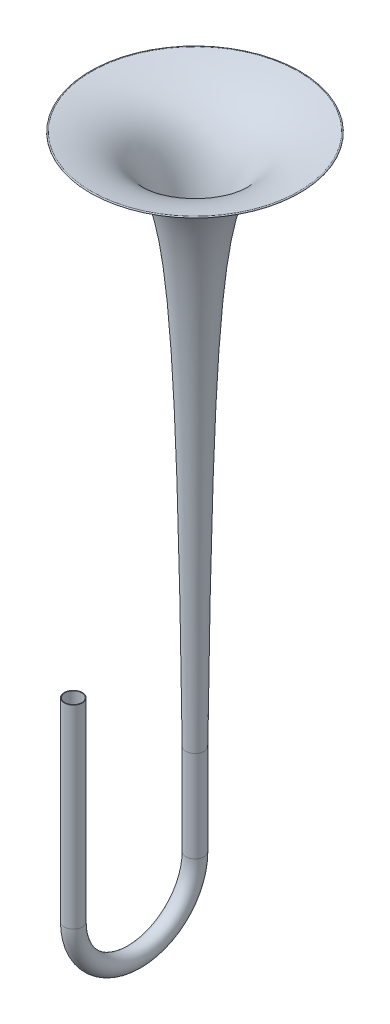
ISO-10303-21;
HEADER;
FILE_DESCRIPTION(('STEP AP214'),'2;1');
FILE_NAME('part.step','',(''),(''),'','','');
FILE_SCHEMA(('AUTOMOTIVE_DESIGN { 1 0 10303 214 1 1 1 1 }'));
ENDSEC;
DATA;
#1=APPLICATION_CONTEXT('core data for automotive mechanical design processes');
#2=APPLICATION_PROTOCOL_DEFINITION('international standard','automotive_design',2000,#1);
#3=PRODUCT_CONTEXT('',#1,'mechanical');
#4=PRODUCT('Part','Part','',(#3));
#5=PRODUCT_RELATED_PRODUCT_CATEGORY('part','',(#4));
#6=PRODUCT_DEFINITION_FORMATION('','',#4);
#7=PRODUCT_DEFINITION_CONTEXT('part definition',#1,'design');
#8=PRODUCT_DEFINITION('design','',#6,#7);
#9=PRODUCT_DEFINITION_SHAPE('','',#8);
#10=(LENGTH_UNIT() NAMED_UNIT(*) SI_UNIT(.MILLI.,.METRE.));
#11=(NAMED_UNIT(*) PLANE_ANGLE_UNIT() SI_UNIT($,.RADIAN.));
#12=(NAMED_UNIT(*) SI_UNIT($,.STERADIAN.) SOLID_ANGLE_UNIT());
#13=UNCERTAINTY_MEASURE_WITH_UNIT(LENGTH_MEASURE(1.E-05),#10,'distance_accuracy_value','');
#14=(GEOMETRIC_REPRESENTATION_CONTEXT(3) GLOBAL_UNCERTAINTY_ASSIGNED_CONTEXT((#13)) GLOBAL_UNIT_ASSIGNED_CONTEXT((#10,
#11,#12)) REPRESENTATION_CONTEXT('',''));
#15=CARTESIAN_POINT('',(0.,0.,0.));
#16=DIRECTION('',(0.,0.,1.));
#17=DIRECTION('',(1.,0.,0.));
#18=AXIS2_PLACEMENT_3D('',#15,#16,#17);
#19=CARTESIAN_POINT('',(0.,9.9999994400852,5.56930453424505));
#20=CARTESIAN_POINT('',(0.,11.6771593695048,5.58652466128567));
#21=CARTESIAN_POINT('',(0.,15.1457515778285,5.62264523749193));
#22=CARTESIAN_POINT('',(0.,22.3111738892659,5.69854234776611));
#23=CARTESIAN_POINT('',(0.,29.9026863124263,5.78292023970477));
#24=CARTESIAN_POINT('',(0.,38.005123869145,5.87608287848823));
#25=CARTESIAN_POINT('',(0.,45.9619840554884,5.97153148324145));
#26=CARTESIAN_POINT('',(0.,53.9718934093684,6.07154406125616));
#27=CARTESIAN_POINT('',(0.,61.9580704924853,6.17563568789492));
#28=CARTESIAN_POINT('',(0.,71.9540091841538,6.31162509277202));
#29=CARTESIAN_POINT('',(0.,83.9421851467425,6.48468392711853));
#30=CARTESIAN_POINT('',(0.,97.9321687017042,6.70260564961952));
#31=CARTESIAN_POINT('',(0.,113.918021035605,6.97737898796497));
#32=CARTESIAN_POINT('',(0.,133.9009253999,7.35835884825183));
#33=CARTESIAN_POINT('',(0.,157.878295894974,7.88741618808818));
#34=CARTESIAN_POINT('',(0.,185.849183671721,8.63986554276172));
#35=CARTESIAN_POINT('',(0.,213.812347304268,9.64027730380191));
#36=CARTESIAN_POINT('',(0.,237.769192336914,10.7872110283682));
#37=CARTESIAN_POINT('',(0.,257.65950101577,12.0540483472179));
#38=CARTESIAN_POINT('',(0.,273.485260338637,13.3306736116295));
#39=CARTESIAN_POINT('',(0.,289.2762488114,15.0007301155883));
#40=CARTESIAN_POINT('',(0.,303.709729866883,17.1090566760086));
#41=CARTESIAN_POINT('',(0.,315.978433866196,19.6739811343625));
#42=CARTESIAN_POINT('',(0.,324.900009202792,22.3810749425223));
#43=CARTESIAN_POINT('',(0.,330.516793837979,24.6267427267683));
#44=CARTESIAN_POINT('',(0.,334.610536027159,26.603227425821));
#45=CARTESIAN_POINT('',(0.,337.843740485149,28.4237852148016));
#46=CARTESIAN_POINT('',(0.,341.142114809204,30.6570427930247));
#47=CARTESIAN_POINT('',(0.,344.398565168112,33.3931215274569));
#48=CARTESIAN_POINT('',(0.,347.21774107738,36.3155854200272));
#49=CARTESIAN_POINT('',(0.,349.777309350856,39.5943461043497));
#50=CARTESIAN_POINT('',(0.,351.83633455812,42.8843295773495));
#51=CARTESIAN_POINT('',(0.,353.484789511713,46.0848140348706));
#52=CARTESIAN_POINT('',(0.,354.888609158709,49.3077375071387));
#53=CARTESIAN_POINT('',(0.,356.046562293958,52.3988936201341));
#54=CARTESIAN_POINT('',(0.,356.939521599587,55.1876480844346));
#55=CARTESIAN_POINT('',(0.,357.634153295233,57.6464780771005));
#56=CARTESIAN_POINT('',(0.,358.128441645298,59.5595608697394));
#57=CARTESIAN_POINT('',(0.,358.459553087406,60.9165237443387));
#58=CARTESIAN_POINT('',(0.,358.734357425871,62.107768237639));
#59=CARTESIAN_POINT('',(0.,358.9597781908,63.1304859836327));
#60=CARTESIAN_POINT('',(0.,359.177572605773,64.1548504325913));
#61=CARTESIAN_POINT('',(0.,359.3539674913,65.0157051235312));
#62=CARTESIAN_POINT('',(0.,359.521090537098,65.8584211304485));
#63=CARTESIAN_POINT('',(0.,359.669119509496,66.6327065617064));
#64=CARTESIAN_POINT('',(0.,359.771954339423,67.1841251192116));
#65=CARTESIAN_POINT('',(0.,359.87334581905,67.7366030412249));
#66=CARTESIAN_POINT('',(0.,359.935824990191,68.0820772305034));
#67=CARTESIAN_POINT('',(0.,359.974446437906,68.2979801545761));
#68=CARTESIAN_POINT('',(0.,359.999999443178,68.4422648628614));
#69=B_SPLINE_CURVE_WITH_KNOTS('',4,(#19,#20,#21,#22,#23,#24,#25,#26,#27,#28,#29,#30,#31,#32,#33,
#34,#35,#36,#37,#38,#39,#40,#41,#42,#43,#44,#45,#46,#47,#48,#49,#50,#51,#52,#53,#54,#55,#56,#57,
#58,#59,#60,#61,#62,#63,#64,#65,#66,#67,#68),.UNSPECIFIED.,.F.,.F.,(5,1,1,1,1,1,1,1,1,1,1,1,1,1,
1,1,1,1,1,1,1,1,1,1,1,1,1,1,1,1,1,1,1,1,1,1,1,1,1,1,1,1,1,1,1,1,5),(0.0778146393450867,
0.0955877287178057,0.113360818259638,0.131133907801471,0.148906997343304,0.166680086885125,
0.184453176426946,0.202226265968768,0.219999355510589,0.255545534602055,0.291091713693521,
0.326637892794492,0.362184071895463,0.43327642991676,0.504368787807759,0.575461145455837,
0.611007323685906,0.646553501915976,0.681599025245944,0.716644548575912,0.752190613321016,
0.776221673991082,0.792943301509696,0.799434965842166,0.805926630174636,0.816630757396425,
0.825911079869655,0.834796341709533,0.843683441910014,0.852674484491738,0.862834906909434,
0.869251628066571,0.875668349223708,0.883922259667913,0.892176170112118,0.895281602136504,
0.898387034160891,0.901492466185277,0.904597898209663,0.906150614221856,0.907703330234049,
0.910808762258436,0.912361478270629,0.913914194282822,0.914690552288918,0.915466910295015,
0.917019626340132),.UNSPECIFIED.);
#70=CARTESIAN_POINT('',(0.,0.,0.));
#71=DIRECTION('',(0.,1.,0.));
#72=AXIS1_PLACEMENT('',#70,#71);
#73=SURFACE_OF_REVOLUTION('',#69,#72);
#74=CARTESIAN_POINT('',(0.,359.963805199045,0.));
#75=DIRECTION('',(0.,1.,0.));
#76=DIRECTION('',(0.,0.,1.));
#77=AXIS2_PLACEMENT_3D('',#74,#75,#76);
#78=CIRCLE('',#77,68.2389494678787);
#79=CARTESIAN_POINT('',(0.,359.963805199045,68.2389494678788));
#80=VERTEX_POINT('',#79);
#81=EDGE_CURVE('E12',#80,#80,#78,.F.);
#82=ORIENTED_EDGE('',*,*,#81,.F.);
#83=EDGE_LOOP('',(#82));
#84=FACE_BOUND('',#83,.T.);
#85=CARTESIAN_POINT('',(0.,9.9999994400852,0.));
#86=DIRECTION('',(0.,1.,0.));
#87=DIRECTION('',(0.,0.,1.));
#88=AXIS2_PLACEMENT_3D('',#85,#86,#87);
#89=CIRCLE('',#88,5.56930453424505);
#90=CARTESIAN_POINT('',(0.,9.9999994400852,5.56930453424505));
#91=VERTEX_POINT('',#90);
#92=EDGE_CURVE('E131',#91,#91,#89,.T.);
#93=ORIENTED_EDGE('',*,*,#92,.F.);
#94=EDGE_LOOP('',(#93));
#95=FACE_BOUND('',#94,.T.);
#96=ADVANCED_FACE('F60',(#84,#95),#73,.F.);
#97=CARTESIAN_POINT('',(0.,0.,0.));
#98=DIRECTION('',(0.,1.,0.));
#99=DIRECTION('',(0.,0.,1.));
#100=AXIS2_PLACEMENT_3D('',#97,#98,#99);
#101=CYLINDRICAL_SURFACE('',#100,5.56930453456339);
#102=ORIENTED_EDGE('',*,*,#92,.T.);
#103=EDGE_LOOP('',(#102));
#104=FACE_BOUND('',#103,.T.);
#105=CARTESIAN_POINT('',(0.,-50.000000497905,0.));
#106=DIRECTION('',(0.,1.,0.));
#107=DIRECTION('',(0.,0.,1.));
#108=AXIS2_PLACEMENT_3D('',#105,#106,#107);
#109=CIRCLE('',#108,5.56930453488173);
#110=CARTESIAN_POINT('',(0.,-50.000000497905,-5.56930453808389));
#111=VERTEX_POINT('',#110);
#112=EDGE_CURVE('E132',#111,#111,#109,.T.);
#113=ORIENTED_EDGE('',*,*,#112,.F.);
#114=EDGE_LOOP('',(#113));
#115=FACE_BOUND('',#114,.T.);
#116=ADVANCED_FACE('F122',(#104,#115),#101,.F.);
#117=CARTESIAN_POINT('',(0.,0.,0.));
#118=DIRECTION('',(0.,1.,0.));
#119=DIRECTION('',(0.,0.,1.));
#120=AXIS2_PLACEMENT_3D('',#117,#118,#119);
#121=CYLINDRICAL_SURFACE('',#120,5.96930453488173);
#122=CARTESIAN_POINT('',(0.,9.99794605575223,0.));
#123=DIRECTION('',(0.,1.,0.));
#124=DIRECTION('',(0.,0.,1.));
#125=AXIS2_PLACEMENT_3D('',#122,#123,#124);
#126=CIRCLE('',#125,5.96930453488174);
#127=CARTESIAN_POINT('',(0.,9.99794605575223,5.96930453488174));
#128=VERTEX_POINT('',#127);
#129=EDGE_CURVE('E94',#128,#128,#126,.T.);
#130=ORIENTED_EDGE('',*,*,#129,.F.);
#131=EDGE_LOOP('',(#130));
#132=FACE_BOUND('',#131,.T.);
#133=CARTESIAN_POINT('',(0.,-50.000000497905,0.));
#134=DIRECTION('',(0.,1.,0.));
#135=DIRECTION('',(0.,0.,1.));
#136=AXIS2_PLACEMENT_3D('',#133,#134,#135);
#137=CIRCLE('',#136,5.96930453488173);
#138=CARTESIAN_POINT('',(0.,-50.000000497905,-5.96930453808388));
#139=VERTEX_POINT('',#138);
#140=EDGE_CURVE('E140',#139,#139,#137,.T.);
#141=ORIENTED_EDGE('',*,*,#140,.T.);
#142=EDGE_LOOP('',(#141));
#143=FACE_BOUND('',#142,.T.);
#144=ADVANCED_FACE('F120',(#132,#143),#121,.T.);
#145=CARTESIAN_POINT('',(0.,9.99794605575223,5.96930453488174));
#146=CARTESIAN_POINT('',(0.,10.8228576840447,5.97777437417187));
#147=CARTESIAN_POINT('',(0.,12.5102335952576,5.99523760363094));
#148=CARTESIAN_POINT('',(0.,14.4130773446558,6.01519523276483));
#149=CARTESIAN_POINT('',(0.,16.4175010436864,6.03634005606872));
#150=CARTESIAN_POINT('',(0.,17.4700958887688,6.04750188631415));
#151=CARTESIAN_POINT('',(0.,19.5962339338443,6.07018815166249));
#152=CARTESIAN_POINT('',(0.,21.7361848431255,6.09316376173852));
#153=CARTESIAN_POINT('',(0.,23.7882718586692,6.11553900874538));
#154=CARTESIAN_POINT('',(0.,25.7902913449199,6.13755450821192));
#155=CARTESIAN_POINT('',(0.,26.7675665904642,6.14839572218408));
#156=CARTESIAN_POINT('',(0.,28.7103322212906,6.17011497974905));
#157=CARTESIAN_POINT('',(0.,30.6425186276233,6.19188344295243));
#158=CARTESIAN_POINT('',(0.,32.5946197426953,6.21417945351665));
#159=CARTESIAN_POINT('',(0.,35.5395323919132,6.24804373643197));
#160=CARTESIAN_POINT('',(0.,37.5188060317032,6.27111513034221));
#161=CARTESIAN_POINT('',(0.,41.4582463776747,6.31775585197646));
#162=CARTESIAN_POINT('',(0.,43.420437399717,6.34134584351328));
#163=CARTESIAN_POINT('',(0.,49.3112124467918,6.41324903713243));
#164=CARTESIAN_POINT('',(0.,53.2487935439486,6.4627445011523));
#165=CARTESIAN_POINT('',(0.,72.904176892351,6.71793242383435));
#166=CARTESIAN_POINT('',(0.,88.6316139506911,6.94715355035292));
#167=CARTESIAN_POINT('',(0.,120.08199288447,7.48381016452694));
#168=CARTESIAN_POINT('',(0.,135.806560845688,7.79047054186769));
#169=CARTESIAN_POINT('',(0.,167.251890174624,8.53472584275086));
#170=CARTESIAN_POINT('',(0.,182.973042440043,8.96998283402628));
#171=CARTESIAN_POINT('',(0.,206.547170304888,9.80918756767168));
#172=CARTESIAN_POINT('',(0.,214.403955158277,10.1203973338859));
#173=CARTESIAN_POINT('',(0.,230.112577575561,10.8374297323074));
#174=CARTESIAN_POINT('',(0.,237.964524357224,11.242813953066));
#175=CARTESIAN_POINT('',(0.,253.658277883212,12.2027775838467));
#176=CARTESIAN_POINT('',(0.,261.500323640948,12.7560442041073));
#177=CARTESIAN_POINT('',(0.,273.245051452853,13.7809381157872));
#178=CARTESIAN_POINT('',(0.,277.15682991004,14.155524889555));
#179=CARTESIAN_POINT('',(0.,284.969464705044,14.9968386955636));
#180=CARTESIAN_POINT('',(0.,288.870472091582,15.4631330077951));
#181=CARTESIAN_POINT('',(0.,296.652543821272,16.5290306825189));
#182=CARTESIAN_POINT('',(0.,300.534129433579,17.1279241118248));
#183=CARTESIAN_POINT('',(0.,308.25869986704,18.5264540860905));
#184=CARTESIAN_POINT('',(0.,312.101995805945,19.325767364126));
#185=CARTESIAN_POINT('',(0.,317.803783401479,20.7658973085015));
#186=CARTESIAN_POINT('',(0.,319.693567249289,21.2865786110673));
#187=CARTESIAN_POINT('',(0.,323.439062314711,22.4327568253567));
#188=CARTESIAN_POINT('',(0.,325.294956331298,23.0582844309755));
#189=CARTESIAN_POINT('',(0.,328.953525365798,24.4441098941524));
#190=CARTESIAN_POINT('',(0.,330.756255183026,25.2044655522832));
#191=CARTESIAN_POINT('',(0.,334.277441893675,26.8952056656778));
#192=CARTESIAN_POINT('',(0.,335.995829792499,27.8260029456764));
#193=CARTESIAN_POINT('',(0.,339.302892655312,29.8914484695341));
#194=CARTESIAN_POINT('',(0.,340.891100123084,31.0266442538893));
#195=CARTESIAN_POINT('',(0.,343.883904159323,33.5166005535127));
#196=CARTESIAN_POINT('',(0.,345.287578780739,34.8715877979746));
#197=CARTESIAN_POINT('',(0.,347.870500888922,37.7820539293535));
#198=CARTESIAN_POINT('',(0.,349.049378983915,39.3369149190991));
#199=CARTESIAN_POINT('',(0.,351.177963118281,42.5986512175043));
#200=CARTESIAN_POINT('',(0.,352.128270056183,44.3047195781934));
#201=CARTESIAN_POINT('',(0.,353.828365650929,47.8164840552584));
#202=CARTESIAN_POINT('',(0.,354.578861167812,49.6218756275127));
#203=CARTESIAN_POINT('',(0.,355.920172892567,53.2932613461727));
#204=CARTESIAN_POINT('',(0.,356.511324913978,55.1593139384407));
#205=CARTESIAN_POINT('',(0.,357.57164036106,58.9276039530998));
#206=CARTESIAN_POINT('',(0.,358.040951308702,60.8304188724889));
#207=CARTESIAN_POINT('',(0.,358.56975743384,63.2214400855851));
#208=CARTESIAN_POINT('',(0.,358.672540454627,63.6999115049843));
#209=CARTESIAN_POINT('',(0.,358.873299880511,64.6615017774475));
#210=CARTESIAN_POINT('',(0.,358.970699981586,65.1413553819113));
#211=CARTESIAN_POINT('',(0.,359.112077770778,65.8567129069654));
#212=CARTESIAN_POINT('',(0.,359.1584778744,66.0947736838547));
#213=CARTESIAN_POINT('',(0.,359.251540413818,66.5795296205518));
#214=CARTESIAN_POINT('',(0.,359.298604001178,66.8284880803904));
#215=CARTESIAN_POINT('',(0.,359.394067761236,67.3408429021024));
#216=CARTESIAN_POINT('',(0.,359.442536834887,67.6046306111527));
#217=CARTESIAN_POINT('',(0.,359.50956221996,67.973254257655));
#218=CARTESIAN_POINT('',(0.,359.530725397424,68.0903079984821));
#219=CARTESIAN_POINT('',(0.,359.570050000414,68.3091064051071));
#220=CARTESIAN_POINT('',(0.,359.588209407779,68.4108393714898));
#221=CARTESIAN_POINT('',(0.,359.60612860604,68.5120198888621));
#222=B_SPLINE_CURVE_WITH_KNOTS('',3,(#145,#146,#147,#148,#149,#150,#151,#152,#153,#154,#155,
#156,#157,#158,#159,#160,#161,#162,#163,#164,#165,#166,#167,#168,#169,#170,#171,#172,#173,#174,
#175,#176,#177,#178,#179,#180,#181,#182,#183,#184,#185,#186,#187,#188,#189,#190,#191,#192,#193,
#194,#195,#196,#197,#198,#199,#200,#201,#202,#203,#204,#205,#206,#207,#208,#209,#210,#211,#212,
#213,#214,#215,#216,#217,#218,#219,#220,#221),.UNSPECIFIED.,.F.,.F.,(4,1,2,2,1,2,2,1,2,2,2,2,2,
2,2,2,2,2,2,2,2,2,2,2,2,2,2,2,2,2,2,2,2,2,2,2,2,2,2,4),(0.,0.00781249999999997,
0.0156249999999999,0.0234374999999999,0.0312499999999999,0.0390624999999999,0.0468749999999998,
0.0546874999999998,0.0624999999999998,0.0781249999999997,0.0937499999999997,0.125,
0.249999999999999,0.374999999999999,0.499999999999999,0.562499999999999,0.624999999999999,
0.687499999999999,0.718749999999999,0.749999999999999,0.781249999999999,0.812499999999999,
0.828124999999999,0.843749999999999,0.859374999999999,0.875,0.890625,0.90625,0.921875,0.9375,
0.953125,0.96875,0.984375,0.98828125,0.9921875,0.994140625,0.99609375,0.998046875,0.9990234375,
1.),.UNSPECIFIED.);
#223=CARTESIAN_POINT('',(0.,0.,0.));
#224=DIRECTION('',(0.,1.,0.));
#225=AXIS1_PLACEMENT('',#223,#224);
#226=SURFACE_OF_REVOLUTION('',#222,#225);
#227=CARTESIAN_POINT('',(0.,359.526849324609,0.));
#228=DIRECTION('',(0.,1.,0.));
#229=DIRECTION('',(0.,0.,1.));
#230=AXIS2_PLACEMENT_3D('',#227,#228,#229);
#231=CIRCLE('',#230,68.0690584960347);
#232=CARTESIAN_POINT('',(0.,359.526849324609,68.0690584960348));
#233=VERTEX_POINT('',#232);
#234=EDGE_CURVE('E61',#233,#233,#231,.F.);
#235=ORIENTED_EDGE('',*,*,#234,.T.);
#236=EDGE_LOOP('',(#235));
#237=FACE_BOUND('',#236,.T.);
#238=ORIENTED_EDGE('',*,*,#129,.T.);
#239=EDGE_LOOP('',(#238));
#240=FACE_BOUND('',#239,.T.);
#241=ADVANCED_FACE('F115',(#237,#240),#226,.T.);
#242=CARTESIAN_POINT('',(0.,-50.000000497905,40.));
#243=DIRECTION('',(-1.,0.,0.));
#244=DIRECTION('',(0.,0.,1.));
#245=AXIS2_PLACEMENT_3D('',#242,#243,#244);
#246=TOROIDAL_SURFACE('',#245,40.,5.96930453808388);
#247=CARTESIAN_POINT('',(0.,-50.000000497905,80.));
#248=DIRECTION('',(0.,1.,0.));
#249=DIRECTION('',(0.,0.,1.));
#250=AXIS2_PLACEMENT_3D('',#247,#248,#249);
#251=CIRCLE('',#250,5.96930453808388);
#252=CARTESIAN_POINT('',(0.,-50.000000497905,85.9693045380839));
#253=VERTEX_POINT('',#252);
#254=EDGE_CURVE('E86',#253,#253,#251,.T.);
#255=CARTESIAN_POINT('',(0.,-50.000000497905,40.));
#256=DIRECTION('',(-1.,0.,0.));
#257=DIRECTION('',(0.,0.,1.));
#258=AXIS2_PLACEMENT_3D('',#255,#256,#257);
#259=CIRCLE('',#258,45.9693045380839);
#260=EDGE_CURVE('',#139,#253,#259,.T.);
#261=ORIENTED_EDGE('',*,*,#140,.F.);
#262=ORIENTED_EDGE('',*,*,#254,.F.);
#263=ORIENTED_EDGE('',*,*,#260,.T.);
#264=ORIENTED_EDGE('',*,*,#260,.F.);
#265=EDGE_LOOP('',(#261,#263,#262,#264));
#266=FACE_BOUND('',#265,.T.);
#267=ADVANCED_FACE('F116',(#266),#246,.T.);
#268=CARTESIAN_POINT('',(0.,-50.000000497905,40.));
#269=DIRECTION('',(-1.,0.,0.));
#270=DIRECTION('',(0.,0.,1.));
#271=AXIS2_PLACEMENT_3D('',#268,#269,#270);
#272=TOROIDAL_SURFACE('',#271,40.,5.56930453808388);
#273=CARTESIAN_POINT('',(0.,-50.000000497905,80.));
#274=DIRECTION('',(0.,1.,0.));
#275=DIRECTION('',(0.,0.,1.));
#276=AXIS2_PLACEMENT_3D('',#273,#274,#275);
#277=CIRCLE('',#276,5.56930453808388);
#278=CARTESIAN_POINT('',(0.,-50.000000497905,85.5693045380839));
#279=VERTEX_POINT('',#278);
#280=EDGE_CURVE('E78',#279,#279,#277,.T.);
#281=CARTESIAN_POINT('',(0.,-50.000000497905,40.));
#282=DIRECTION('',(-1.,0.,0.));
#283=DIRECTION('',(0.,0.,1.));
#284=AXIS2_PLACEMENT_3D('',#281,#282,#283);
#285=CIRCLE('',#284,45.5693045380839);
#286=EDGE_CURVE('',#111,#279,#285,.T.);
#287=ORIENTED_EDGE('',*,*,#112,.T.);
#288=ORIENTED_EDGE('',*,*,#280,.T.);
#289=ORIENTED_EDGE('',*,*,#286,.T.);
#290=ORIENTED_EDGE('',*,*,#286,.F.);
#291=EDGE_LOOP('',(#287,#289,#288,#290));
#292=FACE_BOUND('',#291,.T.);
#293=ADVANCED_FACE('F149',(#292),#272,.F.);
#294=CARTESIAN_POINT('',(0.,359.60612860604,0.));
#295=DIRECTION('',(0.,1.,0.));
#296=DIRECTION('',(0.,0.,1.));
#297=AXIS2_PLACEMENT_3D('',#294,#295,#296);
#298=TOROIDAL_SURFACE('',#297,68.5120198888623,0.450000000000006);
#299=CARTESIAN_POINT('',(0.,359.60612860604,68.5120198888623));
#300=DIRECTION('',(1.,0.,0.));
#301=DIRECTION('',(0.,0.,-1.));
#302=AXIS2_PLACEMENT_3D('',#299,#300,#301);
#303=CIRCLE('',#302,0.450000000000006);
#304=EDGE_CURVE('E71',#80,#233,#303,.T.);
#305=ORIENTED_EDGE('',*,*,#304,.F.);
#306=ORIENTED_EDGE('',*,*,#81,.T.);
#307=ORIENTED_EDGE('',*,*,#304,.T.);
#308=ORIENTED_EDGE('',*,*,#234,.F.);
#309=EDGE_LOOP('',(#305,#306,#307,#308));
#310=FACE_BOUND('',#309,.T.);
#311=ADVANCED_FACE('F80',(#310),#298,.T.);
#312=CARTESIAN_POINT('',(0.,77.559999502095,80.));
#313=DIRECTION('',(0.,1.,0.));
#314=DIRECTION('',(0.,0.,1.));
#315=AXIS2_PLACEMENT_3D('',#312,#313,#314);
#316=PLANE('',#315);
#317=CARTESIAN_POINT('',(0.,77.559999502095,80.));
#318=DIRECTION('',(0.,1.,0.));
#319=DIRECTION('',(-1.,0.,0.));
#320=AXIS2_PLACEMENT_3D('',#317,#318,#319);
#321=CIRCLE('',#320,5.96930453808388);
#322=CARTESIAN_POINT('',(-5.96930453808388,77.559999502095,80.));
#323=VERTEX_POINT('',#322);
#324=EDGE_CURVE('E81',#323,#323,#321,.T.);
#325=ORIENTED_EDGE('',*,*,#324,.T.);
#326=EDGE_LOOP('',(#325));
#327=FACE_BOUND('',#326,.T.);
#328=CARTESIAN_POINT('',(0.,77.559999502095,80.));
#329=DIRECTION('',(0.,1.,0.));
#330=DIRECTION('',(0.,0.,1.));
#331=AXIS2_PLACEMENT_3D('',#328,#329,#330);
#332=CIRCLE('',#331,5.56930453808388);
#333=CARTESIAN_POINT('',(0.,77.559999502095,85.5693045380839));
#334=VERTEX_POINT('',#333);
#335=EDGE_CURVE('E87',#334,#334,#332,.T.);
#336=ORIENTED_EDGE('',*,*,#335,.F.);
#337=EDGE_LOOP('',(#336));
#338=FACE_BOUND('',#337,.T.);
#339=ADVANCED_FACE('F162',(#327,#338),#316,.T.);
#340=CARTESIAN_POINT('',(0.,77.559999502095,80.));
#341=DIRECTION('',(0.,-1.,0.));
#342=DIRECTION('',(0.,0.,-1.));
#343=AXIS2_PLACEMENT_3D('',#340,#341,#342);
#344=CYLINDRICAL_SURFACE('',#343,5.96930453808388);
#345=ORIENTED_EDGE('',*,*,#324,.F.);
#346=EDGE_LOOP('',(#345));
#347=FACE_BOUND('',#346,.T.);
#348=ORIENTED_EDGE('',*,*,#254,.T.);
#349=EDGE_LOOP('',(#348));
#350=FACE_BOUND('',#349,.T.);
#351=ADVANCED_FACE('F157',(#347,#350),#344,.T.);
#352=CARTESIAN_POINT('',(0.,77.559999502095,80.));
#353=DIRECTION('',(0.,-1.,0.));
#354=DIRECTION('',(0.,0.,-1.));
#355=AXIS2_PLACEMENT_3D('',#352,#353,#354);
#356=CYLINDRICAL_SURFACE('',#355,5.56930453808388);
#357=ORIENTED_EDGE('',*,*,#335,.T.);
#358=EDGE_LOOP('',(#357));
#359=FACE_BOUND('',#358,.T.);
#360=ORIENTED_EDGE('',*,*,#280,.F.);
#361=EDGE_LOOP('',(#360));
#362=FACE_BOUND('',#361,.T.);
#363=ADVANCED_FACE('F163',(#359,#362),#356,.F.);
#364=CLOSED_SHELL('',(#96,#116,#144,#241,#267,#293,#311,#339,#351,#363));
#365=MANIFOLD_SOLID_BREP('B2',#364);
#366=ADVANCED_BREP_SHAPE_REPRESENTATION('',(#18,#365),#14);
#367=SHAPE_DEFINITION_REPRESENTATION(#9,#366);
ENDSEC;
END-ISO-10303-21;
